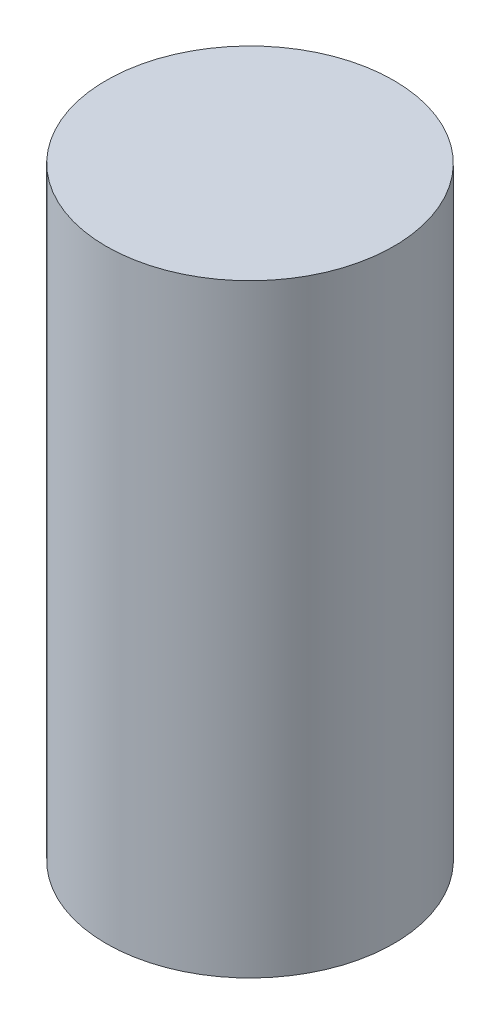
ISO-10303-21;
HEADER;
FILE_DESCRIPTION(('STEP AP214'),'2;1');
FILE_NAME('part.step','',(''),(''),'','','');
FILE_SCHEMA(('AUTOMOTIVE_DESIGN { 1 0 10303 214 1 1 1 1 }'));
ENDSEC;
DATA;
#1=APPLICATION_CONTEXT('core data for automotive mechanical design processes');
#2=APPLICATION_PROTOCOL_DEFINITION('international standard','automotive_design',2000,#1);
#3=PRODUCT_CONTEXT('',#1,'mechanical');
#4=PRODUCT('Part','Part','',(#3));
#5=PRODUCT_RELATED_PRODUCT_CATEGORY('part','',(#4));
#6=PRODUCT_DEFINITION_FORMATION('','',#4);
#7=PRODUCT_DEFINITION_CONTEXT('part definition',#1,'design');
#8=PRODUCT_DEFINITION('design','',#6,#7);
#9=PRODUCT_DEFINITION_SHAPE('','',#8);
#10=(LENGTH_UNIT() NAMED_UNIT(*) SI_UNIT(.MILLI.,.METRE.));
#11=(NAMED_UNIT(*) PLANE_ANGLE_UNIT() SI_UNIT($,.RADIAN.));
#12=(NAMED_UNIT(*) SI_UNIT($,.STERADIAN.) SOLID_ANGLE_UNIT());
#13=UNCERTAINTY_MEASURE_WITH_UNIT(LENGTH_MEASURE(1.E-05),#10,'distance_accuracy_value','');
#14=(GEOMETRIC_REPRESENTATION_CONTEXT(3) GLOBAL_UNCERTAINTY_ASSIGNED_CONTEXT((#13)) GLOBAL_UNIT_ASSIGNED_CONTEXT((#10,
#11,#12)) REPRESENTATION_CONTEXT('',''));
#15=CARTESIAN_POINT('',(0.,0.,0.));
#16=DIRECTION('',(0.,0.,1.));
#17=DIRECTION('',(1.,0.,0.));
#18=AXIS2_PLACEMENT_3D('',#15,#16,#17);
#19=CARTESIAN_POINT('',(0.,210.,0.));
#20=DIRECTION('',(0.,-1.,0.));
#21=DIRECTION('',(0.,0.,-1.));
#22=AXIS2_PLACEMENT_3D('',#19,#20,#21);
#23=CYLINDRICAL_SURFACE('',#22,50.);
#24=CARTESIAN_POINT('',(0.,210.,0.));
#25=DIRECTION('',(0.,1.,0.));
#26=DIRECTION('',(0.,0.,1.));
#27=AXIS2_PLACEMENT_3D('',#24,#25,#26);
#28=CIRCLE('',#27,50.);
#29=CARTESIAN_POINT('',(0.,210.,50.));
#30=VERTEX_POINT('',#29);
#31=EDGE_CURVE('E10',#30,#30,#28,.T.);
#32=ORIENTED_EDGE('',*,*,#31,.F.);
#33=EDGE_LOOP('',(#32));
#34=FACE_BOUND('',#33,.T.);
#35=CARTESIAN_POINT('',(0.,0.,0.));
#36=DIRECTION('',(0.,1.,0.));
#37=DIRECTION('',(0.,0.,1.));
#38=AXIS2_PLACEMENT_3D('',#35,#36,#37);
#39=CIRCLE('',#38,50.);
#40=CARTESIAN_POINT('',(0.,0.,50.));
#41=VERTEX_POINT('',#40);
#42=EDGE_CURVE('E34',#41,#41,#39,.T.);
#43=ORIENTED_EDGE('',*,*,#42,.T.);
#44=EDGE_LOOP('',(#43));
#45=FACE_BOUND('',#44,.T.);
#46=ADVANCED_FACE('F31',(#34,#45),#23,.T.);
#47=CARTESIAN_POINT('',(0.,210.,0.));
#48=DIRECTION('',(0.,1.,0.));
#49=DIRECTION('',(0.,0.,1.));
#50=AXIS2_PLACEMENT_3D('',#47,#48,#49);
#51=PLANE('',#50);
#52=ORIENTED_EDGE('',*,*,#31,.T.);
#53=EDGE_LOOP('',(#52));
#54=FACE_BOUND('',#53,.T.);
#55=ADVANCED_FACE('F46',(#54),#51,.T.);
#56=CARTESIAN_POINT('',(0.,0.,0.));
#57=DIRECTION('',(0.,1.,0.));
#58=DIRECTION('',(0.,0.,1.));
#59=AXIS2_PLACEMENT_3D('',#56,#57,#58);
#60=PLANE('',#59);
#61=ORIENTED_EDGE('',*,*,#42,.F.);
#62=EDGE_LOOP('',(#61));
#63=FACE_BOUND('',#62,.T.);
#64=ADVANCED_FACE('F44',(#63),#60,.F.);
#65=CLOSED_SHELL('',(#46,#55,#64));
#66=MANIFOLD_SOLID_BREP('B2',#65);
#67=ADVANCED_BREP_SHAPE_REPRESENTATION('',(#18,#66),#14);
#68=SHAPE_DEFINITION_REPRESENTATION(#9,#67);
ENDSEC;
END-ISO-10303-21;
